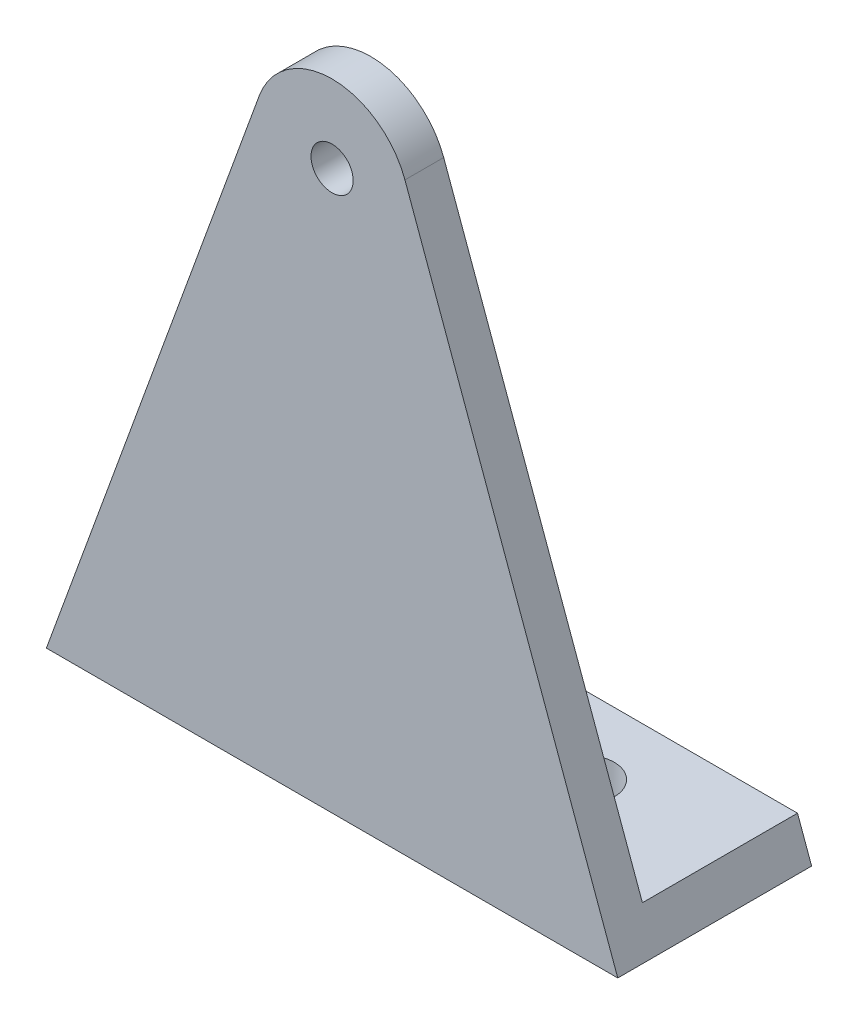
ISO-10303-21;
HEADER;
FILE_DESCRIPTION(('STEP AP214'),'2;1');
FILE_NAME('part.step','',(''),(''),'','','');
FILE_SCHEMA(('AUTOMOTIVE_DESIGN { 1 0 10303 214 1 1 1 1 }'));
ENDSEC;
DATA;
#1=APPLICATION_CONTEXT('core data for automotive mechanical design processes');
#2=APPLICATION_PROTOCOL_DEFINITION('international standard','automotive_design',2000,#1);
#3=PRODUCT_CONTEXT('',#1,'mechanical');
#4=PRODUCT('Part','Part','',(#3));
#5=PRODUCT_RELATED_PRODUCT_CATEGORY('part','',(#4));
#6=PRODUCT_DEFINITION_FORMATION('','',#4);
#7=PRODUCT_DEFINITION_CONTEXT('part definition',#1,'design');
#8=PRODUCT_DEFINITION('design','',#6,#7);
#9=PRODUCT_DEFINITION_SHAPE('','',#8);
#10=(LENGTH_UNIT() NAMED_UNIT(*) SI_UNIT(.MILLI.,.METRE.));
#11=(NAMED_UNIT(*) PLANE_ANGLE_UNIT() SI_UNIT($,.RADIAN.));
#12=(NAMED_UNIT(*) SI_UNIT($,.STERADIAN.) SOLID_ANGLE_UNIT());
#13=UNCERTAINTY_MEASURE_WITH_UNIT(LENGTH_MEASURE(1.E-05),#10,'distance_accuracy_value','');
#14=(GEOMETRIC_REPRESENTATION_CONTEXT(3) GLOBAL_UNCERTAINTY_ASSIGNED_CONTEXT((#13)) GLOBAL_UNIT_ASSIGNED_CONTEXT((#10,
#11,#12)) REPRESENTATION_CONTEXT('',''));
#15=CARTESIAN_POINT('',(0.,0.,0.));
#16=DIRECTION('',(0.,0.,1.));
#17=DIRECTION('',(1.,0.,0.));
#18=AXIS2_PLACEMENT_3D('',#15,#16,#17);
#19=CARTESIAN_POINT('',(-3.18253566009122,19.7661889797999,0.));
#20=DIRECTION('',(0.,0.,1.));
#21=DIRECTION('',(1.,0.,0.));
#22=AXIS2_PLACEMENT_3D('',#19,#20,#21);
#23=PLANE('',#22);
#24=CARTESIAN_POINT('',(-3.18253566009122,19.7661889797999,0.));
#25=DIRECTION('',(0.,0.,-1.));
#26=DIRECTION('',(-1.,0.,0.));
#27=AXIS2_PLACEMENT_3D('',#24,#25,#26);
#28=CIRCLE('',#27,1.7272);
#29=CARTESIAN_POINT('',(-4.90973566009122,19.7661889797999,0.));
#30=VERTEX_POINT('',#29);
#31=EDGE_CURVE('E119',#30,#30,#28,.T.);
#32=ORIENTED_EDGE('',*,*,#31,.F.);
#33=EDGE_LOOP('',(#32));
#34=FACE_BOUND('',#33,.T.);
#35=DIRECTION('',(1.,0.,0.));
#36=VECTOR('',#35,1.);
#37=CARTESIAN_POINT('',(-25.4251781321691,-22.7788110202001,0.));
#38=LINE('',#37,#36);
#39=CARTESIAN_POINT('',(-25.4251781321691,-22.7788110202001,0.));
#40=VERTEX_POINT('',#39);
#41=CARTESIAN_POINT('',(19.0601068119866,-22.7788110202001,0.));
#42=VERTEX_POINT('',#41);
#43=EDGE_CURVE('E52',#40,#42,#38,.T.);
#44=ORIENTED_EDGE('',*,*,#43,.F.);
#45=DIRECTION('',(-0.342020143325673,-0.939692620785907,0.));
#46=VECTOR('',#45,1.);
#47=CARTESIAN_POINT('',(-9.14958380208173,21.938016889918,0.));
#48=LINE('',#47,#46);
#49=CARTESIAN_POINT('',(-9.14958380208173,21.938016889918,0.));
#50=VERTEX_POINT('',#49);
#51=EDGE_CURVE('E129',#50,#40,#48,.T.);
#52=ORIENTED_EDGE('',*,*,#51,.F.);
#53=CARTESIAN_POINT('',(-3.18253566009122,19.7661889797999,0.));
#54=DIRECTION('',(0.,0.,1.));
#55=DIRECTION('',(1.,0.,0.));
#56=AXIS2_PLACEMENT_3D('',#53,#54,#55);
#57=CIRCLE('',#56,6.35);
#58=CARTESIAN_POINT('',(2.78451248189929,21.938016889918,0.));
#59=VERTEX_POINT('',#58);
#60=EDGE_CURVE('E76',#59,#50,#57,.T.);
#61=ORIENTED_EDGE('',*,*,#60,.F.);
#62=DIRECTION('',(-0.342020143325673,0.939692620785907,0.));
#63=VECTOR('',#62,1.);
#64=CARTESIAN_POINT('',(20.2157123057818,-25.9538110202001,0.));
#65=LINE('',#64,#63);
#66=EDGE_CURVE('E134',#42,#59,#65,.T.);
#67=ORIENTED_EDGE('',*,*,#66,.F.);
#68=EDGE_LOOP('',(#44,#52,#61,#67));
#69=FACE_BOUND('',#68,.T.);
#70=ADVANCED_FACE('F36',(#34,#69),#23,.F.);
#71=CARTESIAN_POINT('',(20.2157123057818,-25.9538110202001,3.175));
#72=DIRECTION('',(-0.939692620785907,-0.342020143325673,0.));
#73=DIRECTION('',(0.342020143325673,-0.939692620785907,0.));
#74=AXIS2_PLACEMENT_3D('',#71,#72,#73);
#75=PLANE('',#74);
#76=DIRECTION('',(0.,0.,-1.));
#77=VECTOR('',#76,1.);
#78=CARTESIAN_POINT('',(20.2157123057818,-25.9538110202001,3.175));
#79=LINE('',#78,#77);
#80=CARTESIAN_POINT('',(20.2157123057818,-25.9538110202001,3.175));
#81=VERTEX_POINT('',#80);
#82=CARTESIAN_POINT('',(20.2157123057818,-25.9538110202001,-12.7));
#83=VERTEX_POINT('',#82);
#84=EDGE_CURVE('E103',#81,#83,#79,.T.);
#85=ORIENTED_EDGE('',*,*,#84,.T.);
#86=DIRECTION('',(0.342020143325673,-0.939692620785907,0.));
#87=VECTOR('',#86,1.);
#88=CARTESIAN_POINT('',(19.0601068119866,-22.7788110202001,-12.7));
#89=LINE('',#88,#87);
#90=CARTESIAN_POINT('',(19.0601068119866,-22.7788110202001,-12.7));
#91=VERTEX_POINT('',#90);
#92=EDGE_CURVE('E98',#91,#83,#89,.T.);
#93=ORIENTED_EDGE('',*,*,#92,.F.);
#94=DIRECTION('',(0.,0.,1.));
#95=VECTOR('',#94,1.);
#96=CARTESIAN_POINT('',(19.0601068119866,-22.7788110202001,-12.7));
#97=LINE('',#96,#95);
#98=EDGE_CURVE('E101',#91,#42,#97,.T.);
#99=ORIENTED_EDGE('',*,*,#98,.T.);
#100=ORIENTED_EDGE('',*,*,#66,.T.);
#101=DIRECTION('',(0.,0.,-1.));
#102=VECTOR('',#101,1.);
#103=CARTESIAN_POINT('',(2.78451248189929,21.938016889918,3.175));
#104=LINE('',#103,#102);
#105=CARTESIAN_POINT('',(2.78451248189929,21.938016889918,3.175));
#106=VERTEX_POINT('',#105);
#107=EDGE_CURVE('E11',#106,#59,#104,.T.);
#108=ORIENTED_EDGE('',*,*,#107,.F.);
#109=DIRECTION('',(-0.342020143325673,0.939692620785907,0.));
#110=VECTOR('',#109,1.);
#111=CARTESIAN_POINT('',(20.2157123057818,-25.9538110202001,3.175));
#112=LINE('',#111,#110);
#113=EDGE_CURVE('E127',#81,#106,#112,.T.);
#114=ORIENTED_EDGE('',*,*,#113,.F.);
#115=EDGE_LOOP('',(#85,#93,#99,#100,#108,#114));
#116=FACE_BOUND('',#115,.T.);
#117=ADVANCED_FACE('F38',(#116),#75,.F.);
#118=CARTESIAN_POINT('',(-3.18253566009122,19.7661889797999,3.175));
#119=DIRECTION('',(0.,0.,-1.));
#120=DIRECTION('',(-1.,0.,0.));
#121=AXIS2_PLACEMENT_3D('',#118,#119,#120);
#122=CYLINDRICAL_SURFACE('',#121,6.35);
#123=ORIENTED_EDGE('',*,*,#60,.T.);
#124=DIRECTION('',(0.,0.,-1.));
#125=VECTOR('',#124,1.);
#126=CARTESIAN_POINT('',(-9.14958380208173,21.938016889918,3.175));
#127=LINE('',#126,#125);
#128=CARTESIAN_POINT('',(-9.14958380208173,21.938016889918,3.175));
#129=VERTEX_POINT('',#128);
#130=EDGE_CURVE('E45',#129,#50,#127,.T.);
#131=ORIENTED_EDGE('',*,*,#130,.F.);
#132=CARTESIAN_POINT('',(-3.18253566009122,19.7661889797999,3.175));
#133=DIRECTION('',(0.,0.,1.));
#134=DIRECTION('',(1.,0.,0.));
#135=AXIS2_PLACEMENT_3D('',#132,#133,#134);
#136=CIRCLE('',#135,6.35);
#137=EDGE_CURVE('E81',#106,#129,#136,.T.);
#138=ORIENTED_EDGE('',*,*,#137,.F.);
#139=ORIENTED_EDGE('',*,*,#107,.T.);
#140=EDGE_LOOP('',(#123,#131,#138,#139));
#141=FACE_BOUND('',#140,.T.);
#142=ADVANCED_FACE('F146',(#141),#122,.T.);
#143=CARTESIAN_POINT('',(-9.14958380208173,21.938016889918,3.175));
#144=DIRECTION('',(0.939692620785907,-0.342020143325673,0.));
#145=DIRECTION('',(0.342020143325673,0.939692620785907,0.));
#146=AXIS2_PLACEMENT_3D('',#143,#144,#145);
#147=PLANE('',#146);
#148=ORIENTED_EDGE('',*,*,#51,.T.);
#149=DIRECTION('',(0.,0.,1.));
#150=VECTOR('',#149,1.);
#151=CARTESIAN_POINT('',(-25.4251781321691,-22.7788110202001,-12.7));
#152=LINE('',#151,#150);
#153=CARTESIAN_POINT('',(-25.4251781321691,-22.7788110202001,-12.7));
#154=VERTEX_POINT('',#153);
#155=EDGE_CURVE('E120',#154,#40,#152,.T.);
#156=ORIENTED_EDGE('',*,*,#155,.F.);
#157=DIRECTION('',(0.342020143325672,0.939692620785907,0.));
#158=VECTOR('',#157,1.);
#159=CARTESIAN_POINT('',(-26.5807836259643,-25.9538110202001,-12.7));
#160=LINE('',#159,#158);
#161=CARTESIAN_POINT('',(-26.5807836259643,-25.9538110202001,-12.7));
#162=VERTEX_POINT('',#161);
#163=EDGE_CURVE('E113',#162,#154,#160,.T.);
#164=ORIENTED_EDGE('',*,*,#163,.F.);
#165=DIRECTION('',(0.,0.,-1.));
#166=VECTOR('',#165,1.);
#167=CARTESIAN_POINT('',(-26.5807836259643,-25.9538110202001,3.175));
#168=LINE('',#167,#166);
#169=CARTESIAN_POINT('',(-26.5807836259643,-25.9538110202001,3.175));
#170=VERTEX_POINT('',#169);
#171=EDGE_CURVE('E139',#170,#162,#168,.T.);
#172=ORIENTED_EDGE('',*,*,#171,.F.);
#173=DIRECTION('',(-0.342020143325673,-0.939692620785907,0.));
#174=VECTOR('',#173,1.);
#175=CARTESIAN_POINT('',(-9.14958380208173,21.938016889918,3.175));
#176=LINE('',#175,#174);
#177=EDGE_CURVE('E131',#129,#170,#176,.T.);
#178=ORIENTED_EDGE('',*,*,#177,.F.);
#179=ORIENTED_EDGE('',*,*,#130,.T.);
#180=EDGE_LOOP('',(#148,#156,#164,#172,#178,#179));
#181=FACE_BOUND('',#180,.T.);
#182=ADVANCED_FACE('F143',(#181),#147,.F.);
#183=CARTESIAN_POINT('',(-26.5807836259643,-25.9538110202001,3.175));
#184=DIRECTION('',(0.,1.,0.));
#185=DIRECTION('',(0.,0.,1.));
#186=AXIS2_PLACEMENT_3D('',#183,#184,#185);
#187=PLANE('',#186);
#188=CARTESIAN_POINT('',(-14.3038568961301,-25.9538110202001,-6.35));
#189=DIRECTION('',(0.,1.,0.));
#190=DIRECTION('',(0.,0.,1.));
#191=AXIS2_PLACEMENT_3D('',#188,#189,#190);
#192=CIRCLE('',#191,2.45745);
#193=CARTESIAN_POINT('',(-14.3038568961301,-25.9538110202001,-3.89255));
#194=VERTEX_POINT('',#193);
#195=EDGE_CURVE('E159',#194,#194,#192,.T.);
#196=ORIENTED_EDGE('',*,*,#195,.T.);
#197=EDGE_LOOP('',(#196));
#198=FACE_BOUND('',#197,.T.);
#199=CARTESIAN_POINT('',(7.93878557594771,-25.9538110202001,-6.35));
#200=DIRECTION('',(0.,1.,0.));
#201=DIRECTION('',(0.,0.,1.));
#202=AXIS2_PLACEMENT_3D('',#199,#200,#201);
#203=CIRCLE('',#202,2.45745);
#204=CARTESIAN_POINT('',(7.93878557594771,-25.9538110202001,-3.89255));
#205=VERTEX_POINT('',#204);
#206=EDGE_CURVE('E152',#205,#205,#203,.T.);
#207=ORIENTED_EDGE('',*,*,#206,.T.);
#208=EDGE_LOOP('',(#207));
#209=FACE_BOUND('',#208,.T.);
#210=ORIENTED_EDGE('',*,*,#171,.T.);
#211=DIRECTION('',(-1.,0.,0.));
#212=VECTOR('',#211,1.);
#213=CARTESIAN_POINT('',(20.2157123057818,-25.9538110202001,-12.7));
#214=LINE('',#213,#212);
#215=EDGE_CURVE('E107',#83,#162,#214,.T.);
#216=ORIENTED_EDGE('',*,*,#215,.F.);
#217=ORIENTED_EDGE('',*,*,#84,.F.);
#218=DIRECTION('',(1.,0.,0.));
#219=VECTOR('',#218,1.);
#220=CARTESIAN_POINT('',(-26.5807836259643,-25.9538110202001,3.175));
#221=LINE('',#220,#219);
#222=EDGE_CURVE('E61',#170,#81,#221,.T.);
#223=ORIENTED_EDGE('',*,*,#222,.F.);
#224=EDGE_LOOP('',(#210,#216,#217,#223));
#225=FACE_BOUND('',#224,.T.);
#226=ADVANCED_FACE('F149',(#198,#209,#225),#187,.F.);
#227=CARTESIAN_POINT('',(-3.18253566009122,19.7661889797999,3.175));
#228=DIRECTION('',(0.,0.,1.));
#229=DIRECTION('',(1.,0.,0.));
#230=AXIS2_PLACEMENT_3D('',#227,#228,#229);
#231=PLANE('',#230);
#232=CARTESIAN_POINT('',(-3.18253566009122,19.7661889797999,3.175));
#233=DIRECTION('',(0.,0.,1.));
#234=DIRECTION('',(1.,0.,0.));
#235=AXIS2_PLACEMENT_3D('',#232,#233,#234);
#236=CIRCLE('',#235,1.7272);
#237=CARTESIAN_POINT('',(-1.45533566009122,19.7661889797999,3.175));
#238=VERTEX_POINT('',#237);
#239=EDGE_CURVE('E40',#238,#238,#236,.T.);
#240=ORIENTED_EDGE('',*,*,#239,.F.);
#241=EDGE_LOOP('',(#240));
#242=FACE_BOUND('',#241,.T.);
#243=ORIENTED_EDGE('',*,*,#113,.T.);
#244=ORIENTED_EDGE('',*,*,#137,.T.);
#245=ORIENTED_EDGE('',*,*,#177,.T.);
#246=ORIENTED_EDGE('',*,*,#222,.T.);
#247=EDGE_LOOP('',(#243,#244,#245,#246));
#248=FACE_BOUND('',#247,.T.);
#249=ADVANCED_FACE('F147',(#242,#248),#231,.T.);
#250=CARTESIAN_POINT('',(-3.18253566009122,19.7661889797999,0.));
#251=DIRECTION('',(0.,0.,-1.));
#252=DIRECTION('',(-1.,0.,0.));
#253=AXIS2_PLACEMENT_3D('',#250,#251,#252);
#254=CYLINDRICAL_SURFACE('',#253,1.7272);
#255=ORIENTED_EDGE('',*,*,#239,.T.);
#256=EDGE_LOOP('',(#255));
#257=FACE_BOUND('',#256,.T.);
#258=ORIENTED_EDGE('',*,*,#31,.T.);
#259=EDGE_LOOP('',(#258));
#260=FACE_BOUND('',#259,.T.);
#261=ADVANCED_FACE('F172',(#257,#260),#254,.F.);
#262=CARTESIAN_POINT('',(-25.4251781321691,-22.7788110202001,-12.7));
#263=DIRECTION('',(0.,-1.,0.));
#264=DIRECTION('',(1.,0.,0.));
#265=AXIS2_PLACEMENT_3D('',#262,#263,#264);
#266=PLANE('',#265);
#267=CARTESIAN_POINT('',(-14.3038568961301,-22.7788110202001,-6.35));
#268=DIRECTION('',(0.,1.,0.));
#269=DIRECTION('',(0.,0.,1.));
#270=AXIS2_PLACEMENT_3D('',#267,#268,#269);
#271=CIRCLE('',#270,2.45745);
#272=CARTESIAN_POINT('',(-14.3038568961301,-22.7788110202001,-3.89255));
#273=VERTEX_POINT('',#272);
#274=EDGE_CURVE('E164',#273,#273,#271,.T.);
#275=ORIENTED_EDGE('',*,*,#274,.F.);
#276=EDGE_LOOP('',(#275));
#277=FACE_BOUND('',#276,.T.);
#278=CARTESIAN_POINT('',(7.93878557594771,-22.7788110202001,-6.35));
#279=DIRECTION('',(0.,1.,0.));
#280=DIRECTION('',(0.,0.,1.));
#281=AXIS2_PLACEMENT_3D('',#278,#279,#280);
#282=CIRCLE('',#281,2.45745);
#283=CARTESIAN_POINT('',(7.93878557594771,-22.7788110202001,-3.89255));
#284=VERTEX_POINT('',#283);
#285=EDGE_CURVE('E154',#284,#284,#282,.T.);
#286=ORIENTED_EDGE('',*,*,#285,.F.);
#287=EDGE_LOOP('',(#286));
#288=FACE_BOUND('',#287,.T.);
#289=ORIENTED_EDGE('',*,*,#43,.T.);
#290=ORIENTED_EDGE('',*,*,#98,.F.);
#291=DIRECTION('',(1.,0.,0.));
#292=VECTOR('',#291,1.);
#293=CARTESIAN_POINT('',(-25.4251781321691,-22.7788110202001,-12.7));
#294=LINE('',#293,#292);
#295=EDGE_CURVE('E108',#154,#91,#294,.T.);
#296=ORIENTED_EDGE('',*,*,#295,.F.);
#297=ORIENTED_EDGE('',*,*,#155,.T.);
#298=EDGE_LOOP('',(#289,#290,#296,#297));
#299=FACE_BOUND('',#298,.T.);
#300=ADVANCED_FACE('F118',(#277,#288,#299),#266,.F.);
#301=CARTESIAN_POINT('',(0.,0.,-12.7));
#302=DIRECTION('',(0.,0.,-1.));
#303=DIRECTION('',(-1.,0.,0.));
#304=AXIS2_PLACEMENT_3D('',#301,#302,#303);
#305=PLANE('',#304);
#306=ORIENTED_EDGE('',*,*,#295,.T.);
#307=ORIENTED_EDGE('',*,*,#92,.T.);
#308=ORIENTED_EDGE('',*,*,#215,.T.);
#309=ORIENTED_EDGE('',*,*,#163,.T.);
#310=EDGE_LOOP('',(#306,#307,#308,#309));
#311=FACE_BOUND('',#310,.T.);
#312=ADVANCED_FACE('F111',(#311),#305,.T.);
#313=CARTESIAN_POINT('',(7.93878557594771,-22.7788110202001,-6.35));
#314=DIRECTION('',(0.,1.,0.));
#315=DIRECTION('',(0.,0.,1.));
#316=AXIS2_PLACEMENT_3D('',#313,#314,#315);
#317=CYLINDRICAL_SURFACE('',#316,2.45745);
#318=ORIENTED_EDGE('',*,*,#206,.F.);
#319=EDGE_LOOP('',(#318));
#320=FACE_BOUND('',#319,.T.);
#321=ORIENTED_EDGE('',*,*,#285,.T.);
#322=EDGE_LOOP('',(#321));
#323=FACE_BOUND('',#322,.T.);
#324=ADVANCED_FACE('F176',(#320,#323),#317,.F.);
#325=CARTESIAN_POINT('',(-14.3038568961301,-22.7788110202001,-6.35));
#326=DIRECTION('',(0.,1.,0.));
#327=DIRECTION('',(0.,0.,1.));
#328=AXIS2_PLACEMENT_3D('',#325,#326,#327);
#329=CYLINDRICAL_SURFACE('',#328,2.45745);
#330=ORIENTED_EDGE('',*,*,#195,.F.);
#331=EDGE_LOOP('',(#330));
#332=FACE_BOUND('',#331,.T.);
#333=ORIENTED_EDGE('',*,*,#274,.T.);
#334=EDGE_LOOP('',(#333));
#335=FACE_BOUND('',#334,.T.);
#336=ADVANCED_FACE('F168',(#332,#335),#329,.F.);
#337=CLOSED_SHELL('',(#70,#117,#142,#182,#226,#249,#261,#300,#312,#324,#336));
#338=MANIFOLD_SOLID_BREP('B2',#337);
#339=ADVANCED_BREP_SHAPE_REPRESENTATION('',(#18,#338),#14);
#340=SHAPE_DEFINITION_REPRESENTATION(#9,#339);
ENDSEC;
END-ISO-10303-21;
